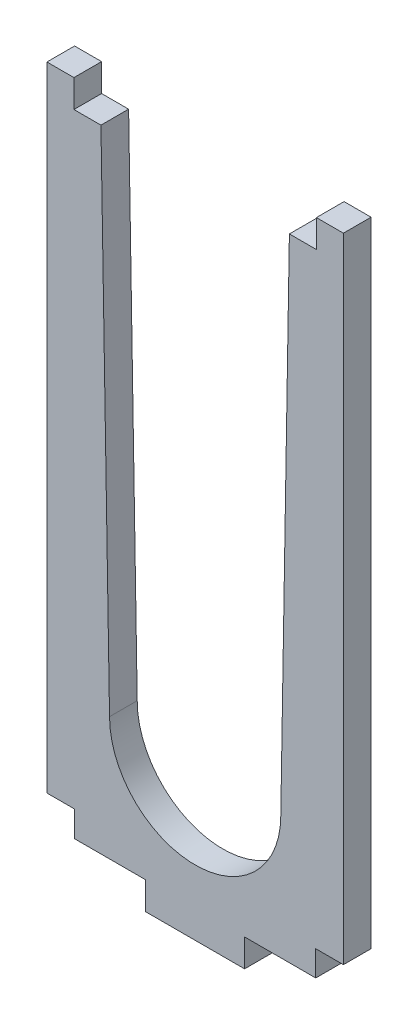
ISO-10303-21;
HEADER;
FILE_DESCRIPTION(('STEP AP214'),'2;1');
FILE_NAME('part.step','',(''),(''),'','','');
FILE_SCHEMA(('AUTOMOTIVE_DESIGN { 1 0 10303 214 1 1 1 1 }'));
ENDSEC;
DATA;
#1=APPLICATION_CONTEXT('core data for automotive mechanical design processes');
#2=APPLICATION_PROTOCOL_DEFINITION('international standard','automotive_design',2000,#1);
#3=PRODUCT_CONTEXT('',#1,'mechanical');
#4=PRODUCT('Part','Part','',(#3));
#5=PRODUCT_RELATED_PRODUCT_CATEGORY('part','',(#4));
#6=PRODUCT_DEFINITION_FORMATION('','',#4);
#7=PRODUCT_DEFINITION_CONTEXT('part definition',#1,'design');
#8=PRODUCT_DEFINITION('design','',#6,#7);
#9=PRODUCT_DEFINITION_SHAPE('','',#8);
#10=(LENGTH_UNIT() NAMED_UNIT(*) SI_UNIT(.MILLI.,.METRE.));
#11=(NAMED_UNIT(*) PLANE_ANGLE_UNIT() SI_UNIT($,.RADIAN.));
#12=(NAMED_UNIT(*) SI_UNIT($,.STERADIAN.) SOLID_ANGLE_UNIT());
#13=UNCERTAINTY_MEASURE_WITH_UNIT(LENGTH_MEASURE(1.E-05),#10,'distance_accuracy_value','');
#14=(GEOMETRIC_REPRESENTATION_CONTEXT(3) GLOBAL_UNCERTAINTY_ASSIGNED_CONTEXT((#13)) GLOBAL_UNIT_ASSIGNED_CONTEXT((#10,
#11,#12)) REPRESENTATION_CONTEXT('',''));
#15=CARTESIAN_POINT('',(0.,0.,0.));
#16=DIRECTION('',(0.,0.,1.));
#17=DIRECTION('',(1.,0.,0.));
#18=AXIS2_PLACEMENT_3D('',#15,#16,#17);
#19=CARTESIAN_POINT('',(57.15,0.,5.334));
#20=DIRECTION('',(-1.,0.,0.));
#21=DIRECTION('',(0.,-1.,0.));
#22=AXIS2_PLACEMENT_3D('',#19,#20,#21);
#23=PLANE('',#22);
#24=DIRECTION('',(0.,1.,0.));
#25=VECTOR('',#24,1.);
#26=CARTESIAN_POINT('',(57.15,0.,5.334));
#27=LINE('',#26,#25);
#28=CARTESIAN_POINT('',(57.15,10.2235,5.334));
#29=VERTEX_POINT('',#28);
#30=CARTESIAN_POINT('',(57.15,132.334,5.334));
#31=VERTEX_POINT('',#30);
#32=EDGE_CURVE('E11',#29,#31,#27,.T.);
#33=ORIENTED_EDGE('',*,*,#32,.F.);
#34=DIRECTION('',(0.,0.,1.));
#35=VECTOR('',#34,1.);
#36=CARTESIAN_POINT('',(57.15,10.2235,0.));
#37=LINE('',#36,#35);
#38=CARTESIAN_POINT('',(57.15,10.2235,0.));
#39=VERTEX_POINT('',#38);
#40=EDGE_CURVE('E226',#39,#29,#37,.T.);
#41=ORIENTED_EDGE('',*,*,#40,.F.);
#42=DIRECTION('',(0.,1.,0.));
#43=VECTOR('',#42,1.);
#44=CARTESIAN_POINT('',(57.15,0.,0.));
#45=LINE('',#44,#43);
#46=CARTESIAN_POINT('',(57.15,132.334,0.));
#47=VERTEX_POINT('',#46);
#48=EDGE_CURVE('E41',#39,#47,#45,.T.);
#49=ORIENTED_EDGE('',*,*,#48,.T.);
#50=DIRECTION('',(0.,0.,-1.));
#51=VECTOR('',#50,1.);
#52=CARTESIAN_POINT('',(57.15,132.334,0.));
#53=LINE('',#52,#51);
#54=EDGE_CURVE('E286',#31,#47,#53,.T.);
#55=ORIENTED_EDGE('',*,*,#54,.F.);
#56=EDGE_LOOP('',(#33,#41,#49,#55));
#57=FACE_BOUND('',#56,.T.);
#58=ADVANCED_FACE('F37',(#57),#23,.F.);
#59=CARTESIAN_POINT('',(0.,0.,5.334));
#60=DIRECTION('',(1.,0.,0.));
#61=DIRECTION('',(0.,1.,0.));
#62=AXIS2_PLACEMENT_3D('',#59,#60,#61);
#63=PLANE('',#62);
#64=DIRECTION('',(0.,-1.,0.));
#65=VECTOR('',#64,1.);
#66=CARTESIAN_POINT('',(0.,0.,0.));
#67=LINE('',#66,#65);
#68=CARTESIAN_POINT('',(0.,132.334,0.));
#69=VERTEX_POINT('',#68);
#70=CARTESIAN_POINT('',(0.,10.2997,0.));
#71=VERTEX_POINT('',#70);
#72=EDGE_CURVE('E343',#69,#71,#67,.T.);
#73=ORIENTED_EDGE('',*,*,#72,.T.);
#74=DIRECTION('',(0.,0.,1.));
#75=VECTOR('',#74,1.);
#76=CARTESIAN_POINT('',(0.,10.2997,0.));
#77=LINE('',#76,#75);
#78=CARTESIAN_POINT('',(0.,10.2997,5.334));
#79=VERTEX_POINT('',#78);
#80=EDGE_CURVE('E218',#71,#79,#77,.T.);
#81=ORIENTED_EDGE('',*,*,#80,.T.);
#82=DIRECTION('',(0.,-1.,0.));
#83=VECTOR('',#82,1.);
#84=CARTESIAN_POINT('',(0.,0.,5.334));
#85=LINE('',#84,#83);
#86=CARTESIAN_POINT('',(0.,132.334,5.334));
#87=VERTEX_POINT('',#86);
#88=EDGE_CURVE('E349',#87,#79,#85,.T.);
#89=ORIENTED_EDGE('',*,*,#88,.F.);
#90=DIRECTION('',(0.,0.,1.));
#91=VECTOR('',#90,1.);
#92=CARTESIAN_POINT('',(0.,132.334,0.));
#93=LINE('',#92,#91);
#94=EDGE_CURVE('E262',#69,#87,#93,.T.);
#95=ORIENTED_EDGE('',*,*,#94,.F.);
#96=EDGE_LOOP('',(#73,#81,#89,#95));
#97=FACE_BOUND('',#96,.T.);
#98=ADVANCED_FACE('F39',(#97),#63,.F.);
#99=CARTESIAN_POINT('',(0.,0.,5.334));
#100=DIRECTION('',(0.,1.,0.));
#101=DIRECTION('',(0.,0.,1.));
#102=AXIS2_PLACEMENT_3D('',#99,#100,#101);
#103=PLANE('',#102);
#104=DIRECTION('',(1.,0.,0.));
#105=VECTOR('',#104,1.);
#106=CARTESIAN_POINT('',(0.,0.,0.));
#107=LINE('',#106,#105);
#108=CARTESIAN_POINT('',(19.05,0.,0.));
#109=VERTEX_POINT('',#108);
#110=CARTESIAN_POINT('',(38.1,0.,0.));
#111=VERTEX_POINT('',#110);
#112=EDGE_CURVE('E355',#109,#111,#107,.T.);
#113=ORIENTED_EDGE('',*,*,#112,.T.);
#114=DIRECTION('',(0.,0.,-1.));
#115=VECTOR('',#114,1.);
#116=CARTESIAN_POINT('',(38.1,0.,0.));
#117=LINE('',#116,#115);
#118=CARTESIAN_POINT('',(38.1,0.,5.334));
#119=VERTEX_POINT('',#118);
#120=EDGE_CURVE('E296',#119,#111,#117,.T.);
#121=ORIENTED_EDGE('',*,*,#120,.F.);
#122=DIRECTION('',(1.,0.,0.));
#123=VECTOR('',#122,1.);
#124=CARTESIAN_POINT('',(0.,0.,5.334));
#125=LINE('',#124,#123);
#126=CARTESIAN_POINT('',(19.05,0.,5.334));
#127=VERTEX_POINT('',#126);
#128=EDGE_CURVE('E46',#127,#119,#125,.T.);
#129=ORIENTED_EDGE('',*,*,#128,.F.);
#130=DIRECTION('',(0.,0.,1.));
#131=VECTOR('',#130,1.);
#132=CARTESIAN_POINT('',(19.05,0.,0.));
#133=LINE('',#132,#131);
#134=EDGE_CURVE('E292',#109,#127,#133,.T.);
#135=ORIENTED_EDGE('',*,*,#134,.F.);
#136=EDGE_LOOP('',(#113,#121,#129,#135));
#137=FACE_BOUND('',#136,.T.);
#138=ADVANCED_FACE('F401',(#137),#103,.F.);
#139=CARTESIAN_POINT('',(0.,0.,5.334));
#140=DIRECTION('',(0.,0.,-1.));
#141=DIRECTION('',(-1.,0.,0.));
#142=AXIS2_PLACEMENT_3D('',#139,#140,#141);
#143=PLANE('',#142);
#144=ORIENTED_EDGE('',*,*,#88,.T.);
#145=DIRECTION('',(-1.,0.,0.));
#146=VECTOR('',#145,1.);
#147=CARTESIAN_POINT('',(0.,10.2997,5.334));
#148=LINE('',#147,#146);
#149=CARTESIAN_POINT('',(5.33576550806197,10.2997,5.334));
#150=VERTEX_POINT('',#149);
#151=EDGE_CURVE('E209',#150,#79,#148,.T.);
#152=ORIENTED_EDGE('',*,*,#151,.F.);
#153=DIRECTION('',(0.,1.,0.));
#154=VECTOR('',#153,1.);
#155=CARTESIAN_POINT('',(5.33576550806197,9.84249999999998,5.334));
#156=LINE('',#155,#154);
#157=CARTESIAN_POINT('',(5.33576550806197,9.84249999999998,5.334));
#158=VERTEX_POINT('',#157);
#159=EDGE_CURVE('E211',#158,#150,#156,.T.);
#160=ORIENTED_EDGE('',*,*,#159,.F.);
#161=DIRECTION('',(1.,0.,0.));
#162=VECTOR('',#161,1.);
#163=CARTESIAN_POINT('',(0.,9.84249999999998,5.334));
#164=LINE('',#163,#162);
#165=CARTESIAN_POINT('',(5.334,9.84249999999998,5.334));
#166=VERTEX_POINT('',#165);
#167=EDGE_CURVE('E193',#166,#158,#164,.T.);
#168=ORIENTED_EDGE('',*,*,#167,.F.);
#169=DIRECTION('',(0.,1.,0.));
#170=VECTOR('',#169,1.);
#171=CARTESIAN_POINT('',(5.334,5.334,5.334));
#172=LINE('',#171,#170);
#173=CARTESIAN_POINT('',(5.334,5.334,5.334));
#174=VERTEX_POINT('',#173);
#175=EDGE_CURVE('E241',#174,#166,#172,.T.);
#176=ORIENTED_EDGE('',*,*,#175,.F.);
#177=DIRECTION('',(-1.,0.,0.));
#178=VECTOR('',#177,1.);
#179=CARTESIAN_POINT('',(0.,5.334,5.334));
#180=LINE('',#179,#178);
#181=CARTESIAN_POINT('',(19.05,5.334,5.334));
#182=VERTEX_POINT('',#181);
#183=EDGE_CURVE('E314',#182,#174,#180,.T.);
#184=ORIENTED_EDGE('',*,*,#183,.F.);
#185=DIRECTION('',(0.,-1.,0.));
#186=VECTOR('',#185,1.);
#187=CARTESIAN_POINT('',(19.05,5.334,5.334));
#188=LINE('',#187,#186);
#189=EDGE_CURVE('E303',#182,#127,#188,.T.);
#190=ORIENTED_EDGE('',*,*,#189,.T.);
#191=ORIENTED_EDGE('',*,*,#128,.T.);
#192=DIRECTION('',(0.,-1.,0.));
#193=VECTOR('',#192,1.);
#194=CARTESIAN_POINT('',(38.1,5.334,5.334));
#195=LINE('',#194,#193);
#196=CARTESIAN_POINT('',(38.1,5.334,5.334));
#197=VERTEX_POINT('',#196);
#198=EDGE_CURVE('E301',#197,#119,#195,.T.);
#199=ORIENTED_EDGE('',*,*,#198,.F.);
#200=DIRECTION('',(-1.,0.,0.));
#201=VECTOR('',#200,1.);
#202=CARTESIAN_POINT('',(57.15,5.334,5.334));
#203=LINE('',#202,#201);
#204=CARTESIAN_POINT('',(51.816,5.334,5.334));
#205=VERTEX_POINT('',#204);
#206=EDGE_CURVE('E293',#205,#197,#203,.T.);
#207=ORIENTED_EDGE('',*,*,#206,.F.);
#208=DIRECTION('',(0.,1.,0.));
#209=VECTOR('',#208,1.);
#210=CARTESIAN_POINT('',(51.816,9.84250000000004,5.334));
#211=LINE('',#210,#209);
#212=CARTESIAN_POINT('',(51.816,10.2235,5.334));
#213=VERTEX_POINT('',#212);
#214=EDGE_CURVE('E221',#205,#213,#211,.T.);
#215=ORIENTED_EDGE('',*,*,#214,.T.);
#216=DIRECTION('',(-1.,0.,0.));
#217=VECTOR('',#216,1.);
#218=CARTESIAN_POINT('',(51.816,10.2235,5.334));
#219=LINE('',#218,#217);
#220=EDGE_CURVE('E227',#29,#213,#219,.T.);
#221=ORIENTED_EDGE('',*,*,#220,.F.);
#222=ORIENTED_EDGE('',*,*,#32,.T.);
#223=DIRECTION('',(1.,0.,0.));
#224=VECTOR('',#223,1.);
#225=CARTESIAN_POINT('',(46.736,132.334,5.334));
#226=LINE('',#225,#224);
#227=CARTESIAN_POINT('',(51.943,132.334,5.334));
#228=VERTEX_POINT('',#227);
#229=EDGE_CURVE('E283',#228,#31,#226,.T.);
#230=ORIENTED_EDGE('',*,*,#229,.F.);
#231=DIRECTION('',(0.,1.,0.));
#232=VECTOR('',#231,1.);
#233=CARTESIAN_POINT('',(51.943,127.,5.334));
#234=LINE('',#233,#232);
#235=CARTESIAN_POINT('',(51.943,127.,5.334));
#236=VERTEX_POINT('',#235);
#237=EDGE_CURVE('E62',#236,#228,#234,.T.);
#238=ORIENTED_EDGE('',*,*,#237,.F.);
#239=DIRECTION('',(1.,0.,0.));
#240=VECTOR('',#239,1.);
#241=CARTESIAN_POINT('',(46.736,127.,5.334));
#242=LINE('',#241,#240);
#243=CARTESIAN_POINT('',(46.736,127.,5.334));
#244=VERTEX_POINT('',#243);
#245=EDGE_CURVE('E264',#244,#236,#242,.T.);
#246=ORIENTED_EDGE('',*,*,#245,.F.);
#247=DIRECTION('',(-0.0169080241525073,-0.999857049142155,0.));
#248=VECTOR('',#247,1.);
#249=CARTESIAN_POINT('',(44.5756269461976,-0.753793532451566,5.334));
#250=LINE('',#249,#248);
#251=CARTESIAN_POINT('',(45.0801802982121,29.083,5.334));
#252=VERTEX_POINT('',#251);
#253=EDGE_CURVE('E326',#244,#252,#250,.T.);
#254=ORIENTED_EDGE('',*,*,#253,.T.);
#255=CARTESIAN_POINT('',(28.575,29.083,5.334));
#256=DIRECTION('',(0.,0.,1.));
#257=DIRECTION('',(1.,0.,0.));
#258=AXIS2_PLACEMENT_3D('',#255,#256,#257);
#259=CIRCLE('',#258,16.5051802982121);
#260=CARTESIAN_POINT('',(12.0698197017879,29.083,5.334));
#261=VERTEX_POINT('',#260);
#262=EDGE_CURVE('E335',#261,#252,#259,.T.);
#263=ORIENTED_EDGE('',*,*,#262,.F.);
#264=DIRECTION('',(0.0169080241525077,-0.999857049142155,0.));
#265=VECTOR('',#264,1.);
#266=CARTESIAN_POINT('',(12.5580349386081,0.212361915367997,5.334));
#267=LINE('',#266,#265);
#268=CARTESIAN_POINT('',(10.414,127.,5.334));
#269=VERTEX_POINT('',#268);
#270=EDGE_CURVE('E307',#269,#261,#267,.T.);
#271=ORIENTED_EDGE('',*,*,#270,.F.);
#272=DIRECTION('',(1.,0.,0.));
#273=VECTOR('',#272,1.);
#274=CARTESIAN_POINT('',(10.414,127.,5.334));
#275=LINE('',#274,#273);
#276=CARTESIAN_POINT('',(5.20699999999999,127.,5.334));
#277=VERTEX_POINT('',#276);
#278=EDGE_CURVE('E254',#277,#269,#275,.T.);
#279=ORIENTED_EDGE('',*,*,#278,.F.);
#280=DIRECTION('',(0.,1.,0.));
#281=VECTOR('',#280,1.);
#282=CARTESIAN_POINT('',(5.20699999999999,127.,5.334));
#283=LINE('',#282,#281);
#284=CARTESIAN_POINT('',(5.20699999999999,132.334,5.334));
#285=VERTEX_POINT('',#284);
#286=EDGE_CURVE('E259',#277,#285,#283,.T.);
#287=ORIENTED_EDGE('',*,*,#286,.T.);
#288=DIRECTION('',(1.,0.,0.));
#289=VECTOR('',#288,1.);
#290=CARTESIAN_POINT('',(0.,132.334,5.334));
#291=LINE('',#290,#289);
#292=EDGE_CURVE('E278',#87,#285,#291,.T.);
#293=ORIENTED_EDGE('',*,*,#292,.F.);
#294=EDGE_LOOP('',(#144,#152,#160,#168,#176,#184,#190,#191,#199,#207,#215,#221,#222,#230,#238,
#246,#254,#263,#271,#279,#287,#293));
#295=FACE_BOUND('',#294,.T.);
#296=ADVANCED_FACE('F379',(#295),#143,.F.);
#297=CARTESIAN_POINT('',(0.,0.,0.));
#298=DIRECTION('',(0.,0.,-1.));
#299=DIRECTION('',(-1.,0.,0.));
#300=AXIS2_PLACEMENT_3D('',#297,#298,#299);
#301=PLANE('',#300);
#302=DIRECTION('',(-1.,0.,0.));
#303=VECTOR('',#302,1.);
#304=CARTESIAN_POINT('',(0.,10.2997,0.));
#305=LINE('',#304,#303);
#306=CARTESIAN_POINT('',(5.33576550806197,10.2997,0.));
#307=VERTEX_POINT('',#306);
#308=EDGE_CURVE('E198',#307,#71,#305,.T.);
#309=ORIENTED_EDGE('',*,*,#308,.T.);
#310=ORIENTED_EDGE('',*,*,#72,.F.);
#311=DIRECTION('',(-1.,0.,0.));
#312=VECTOR('',#311,1.);
#313=CARTESIAN_POINT('',(0.,132.334,0.));
#314=LINE('',#313,#312);
#315=CARTESIAN_POINT('',(5.20699999999999,132.334,0.));
#316=VERTEX_POINT('',#315);
#317=EDGE_CURVE('E281',#316,#69,#314,.T.);
#318=ORIENTED_EDGE('',*,*,#317,.F.);
#319=DIRECTION('',(0.,1.,0.));
#320=VECTOR('',#319,1.);
#321=CARTESIAN_POINT('',(5.20699999999999,127.,0.));
#322=LINE('',#321,#320);
#323=CARTESIAN_POINT('',(5.20699999999999,127.,0.));
#324=VERTEX_POINT('',#323);
#325=EDGE_CURVE('E256',#324,#316,#322,.T.);
#326=ORIENTED_EDGE('',*,*,#325,.F.);
#327=DIRECTION('',(-1.,0.,0.));
#328=VECTOR('',#327,1.);
#329=CARTESIAN_POINT('',(10.414,127.,0.));
#330=LINE('',#329,#328);
#331=CARTESIAN_POINT('',(10.414,127.,0.));
#332=VERTEX_POINT('',#331);
#333=EDGE_CURVE('E247',#332,#324,#330,.T.);
#334=ORIENTED_EDGE('',*,*,#333,.F.);
#335=DIRECTION('',(0.0169080241525077,-0.999857049142155,0.));
#336=VECTOR('',#335,1.);
#337=CARTESIAN_POINT('',(12.5580349386081,0.212361915367997,0.));
#338=LINE('',#337,#336);
#339=CARTESIAN_POINT('',(12.0698197017879,29.083,0.));
#340=VERTEX_POINT('',#339);
#341=EDGE_CURVE('E322',#332,#340,#338,.T.);
#342=ORIENTED_EDGE('',*,*,#341,.T.);
#343=CARTESIAN_POINT('',(28.575,29.083,0.));
#344=DIRECTION('',(0.,0.,1.));
#345=DIRECTION('',(1.,0.,0.));
#346=AXIS2_PLACEMENT_3D('',#343,#344,#345);
#347=CIRCLE('',#346,16.5051802982121);
#348=CARTESIAN_POINT('',(45.0801802982121,29.083,0.));
#349=VERTEX_POINT('',#348);
#350=EDGE_CURVE('E325',#340,#349,#347,.T.);
#351=ORIENTED_EDGE('',*,*,#350,.T.);
#352=DIRECTION('',(-0.0169080241525073,-0.999857049142155,0.));
#353=VECTOR('',#352,1.);
#354=CARTESIAN_POINT('',(44.5756269461976,-0.753793532451566,0.));
#355=LINE('',#354,#353);
#356=CARTESIAN_POINT('',(46.736,127.,0.));
#357=VERTEX_POINT('',#356);
#358=EDGE_CURVE('E329',#357,#349,#355,.T.);
#359=ORIENTED_EDGE('',*,*,#358,.F.);
#360=DIRECTION('',(-1.,0.,0.));
#361=VECTOR('',#360,1.);
#362=CARTESIAN_POINT('',(46.736,127.,0.));
#363=LINE('',#362,#361);
#364=CARTESIAN_POINT('',(51.943,127.,0.));
#365=VERTEX_POINT('',#364);
#366=EDGE_CURVE('E270',#365,#357,#363,.T.);
#367=ORIENTED_EDGE('',*,*,#366,.F.);
#368=DIRECTION('',(0.,1.,0.));
#369=VECTOR('',#368,1.);
#370=CARTESIAN_POINT('',(51.943,127.,0.));
#371=LINE('',#370,#369);
#372=CARTESIAN_POINT('',(51.943,132.334,0.));
#373=VERTEX_POINT('',#372);
#374=EDGE_CURVE('E258',#365,#373,#371,.T.);
#375=ORIENTED_EDGE('',*,*,#374,.T.);
#376=DIRECTION('',(-1.,0.,0.));
#377=VECTOR('',#376,1.);
#378=CARTESIAN_POINT('',(46.736,132.334,0.));
#379=LINE('',#378,#377);
#380=EDGE_CURVE('E289',#47,#373,#379,.T.);
#381=ORIENTED_EDGE('',*,*,#380,.F.);
#382=ORIENTED_EDGE('',*,*,#48,.F.);
#383=DIRECTION('',(-1.,0.,0.));
#384=VECTOR('',#383,1.);
#385=CARTESIAN_POINT('',(51.816,10.2235,0.));
#386=LINE('',#385,#384);
#387=CARTESIAN_POINT('',(51.816,10.2235,0.));
#388=VERTEX_POINT('',#387);
#389=EDGE_CURVE('E223',#39,#388,#386,.T.);
#390=ORIENTED_EDGE('',*,*,#389,.T.);
#391=DIRECTION('',(0.,1.,0.));
#392=VECTOR('',#391,1.);
#393=CARTESIAN_POINT('',(51.816,5.334,0.));
#394=LINE('',#393,#392);
#395=CARTESIAN_POINT('',(51.816,5.334,0.));
#396=VERTEX_POINT('',#395);
#397=EDGE_CURVE('E234',#396,#388,#394,.T.);
#398=ORIENTED_EDGE('',*,*,#397,.F.);
#399=DIRECTION('',(1.,0.,0.));
#400=VECTOR('',#399,1.);
#401=CARTESIAN_POINT('',(57.15,5.334,0.));
#402=LINE('',#401,#400);
#403=CARTESIAN_POINT('',(38.1,5.334,0.));
#404=VERTEX_POINT('',#403);
#405=EDGE_CURVE('E298',#404,#396,#402,.T.);
#406=ORIENTED_EDGE('',*,*,#405,.F.);
#407=DIRECTION('',(0.,-1.,0.));
#408=VECTOR('',#407,1.);
#409=CARTESIAN_POINT('',(38.1,5.334,0.));
#410=LINE('',#409,#408);
#411=EDGE_CURVE('E304',#404,#111,#410,.T.);
#412=ORIENTED_EDGE('',*,*,#411,.T.);
#413=ORIENTED_EDGE('',*,*,#112,.F.);
#414=DIRECTION('',(0.,-1.,0.));
#415=VECTOR('',#414,1.);
#416=CARTESIAN_POINT('',(19.05,5.334,0.));
#417=LINE('',#416,#415);
#418=CARTESIAN_POINT('',(19.05,5.334,0.));
#419=VERTEX_POINT('',#418);
#420=EDGE_CURVE('E317',#419,#109,#417,.T.);
#421=ORIENTED_EDGE('',*,*,#420,.F.);
#422=DIRECTION('',(1.,0.,0.));
#423=VECTOR('',#422,1.);
#424=CARTESIAN_POINT('',(0.,5.334,0.));
#425=LINE('',#424,#423);
#426=CARTESIAN_POINT('',(5.334,5.334,0.));
#427=VERTEX_POINT('',#426);
#428=EDGE_CURVE('E309',#427,#419,#425,.T.);
#429=ORIENTED_EDGE('',*,*,#428,.F.);
#430=DIRECTION('',(0.,-1.,0.));
#431=VECTOR('',#430,1.);
#432=CARTESIAN_POINT('',(5.334,5.334,0.));
#433=LINE('',#432,#431);
#434=CARTESIAN_POINT('',(5.334,9.84249999999998,0.));
#435=VERTEX_POINT('',#434);
#436=EDGE_CURVE('E54',#435,#427,#433,.T.);
#437=ORIENTED_EDGE('',*,*,#436,.F.);
#438=DIRECTION('',(1.,0.,0.));
#439=VECTOR('',#438,1.);
#440=CARTESIAN_POINT('',(0.,9.84249999999998,0.));
#441=LINE('',#440,#439);
#442=CARTESIAN_POINT('',(5.33576550806197,9.84249999999998,0.));
#443=VERTEX_POINT('',#442);
#444=EDGE_CURVE('E191',#435,#443,#441,.T.);
#445=ORIENTED_EDGE('',*,*,#444,.T.);
#446=DIRECTION('',(0.,1.,0.));
#447=VECTOR('',#446,1.);
#448=CARTESIAN_POINT('',(5.33576550806197,9.84249999999998,0.));
#449=LINE('',#448,#447);
#450=EDGE_CURVE('E201',#443,#307,#449,.T.);
#451=ORIENTED_EDGE('',*,*,#450,.T.);
#452=EDGE_LOOP('',(#309,#310,#318,#326,#334,#342,#351,#359,#367,#375,#381,#382,#390,#398,#406,
#412,#413,#421,#429,#437,#445,#451));
#453=FACE_BOUND('',#452,.T.);
#454=ADVANCED_FACE('F207',(#453),#301,.T.);
#455=CARTESIAN_POINT('',(12.5580349386081,0.212361915367997,0.));
#456=DIRECTION('',(-0.999857049142155,-0.0169080241525077,0.));
#457=DIRECTION('',(0.0169080241525077,-0.999857049142155,0.));
#458=AXIS2_PLACEMENT_3D('',#455,#456,#457);
#459=PLANE('',#458);
#460=ORIENTED_EDGE('',*,*,#270,.T.);
#461=DIRECTION('',(0.,0.,1.));
#462=VECTOR('',#461,1.);
#463=CARTESIAN_POINT('',(12.0698197017879,29.083,0.));
#464=LINE('',#463,#462);
#465=EDGE_CURVE('E332',#340,#261,#464,.T.);
#466=ORIENTED_EDGE('',*,*,#465,.F.);
#467=ORIENTED_EDGE('',*,*,#341,.F.);
#468=DIRECTION('',(0.,0.,1.));
#469=VECTOR('',#468,1.);
#470=CARTESIAN_POINT('',(10.414,127.,0.));
#471=LINE('',#470,#469);
#472=EDGE_CURVE('E340',#332,#269,#471,.T.);
#473=ORIENTED_EDGE('',*,*,#472,.T.);
#474=EDGE_LOOP('',(#460,#466,#467,#473));
#475=FACE_BOUND('',#474,.T.);
#476=ADVANCED_FACE('F429',(#475),#459,.F.);
#477=CARTESIAN_POINT('',(44.5756269461976,-0.753793532451566,0.));
#478=DIRECTION('',(-0.999857049142155,0.0169080241525073,0.));
#479=DIRECTION('',(-0.0169080241525073,-0.999857049142155,0.));
#480=AXIS2_PLACEMENT_3D('',#477,#478,#479);
#481=PLANE('',#480);
#482=ORIENTED_EDGE('',*,*,#253,.F.);
#483=DIRECTION('',(0.,0.,1.));
#484=VECTOR('',#483,1.);
#485=CARTESIAN_POINT('',(46.736,127.,0.));
#486=LINE('',#485,#484);
#487=EDGE_CURVE('E344',#357,#244,#486,.T.);
#488=ORIENTED_EDGE('',*,*,#487,.F.);
#489=ORIENTED_EDGE('',*,*,#358,.T.);
#490=DIRECTION('',(0.,0.,1.));
#491=VECTOR('',#490,1.);
#492=CARTESIAN_POINT('',(45.0801802982121,29.083,0.));
#493=LINE('',#492,#491);
#494=EDGE_CURVE('E346',#349,#252,#493,.T.);
#495=ORIENTED_EDGE('',*,*,#494,.T.);
#496=EDGE_LOOP('',(#482,#488,#489,#495));
#497=FACE_BOUND('',#496,.T.);
#498=ADVANCED_FACE('F434',(#497),#481,.T.);
#499=CARTESIAN_POINT('',(28.575,29.083,0.));
#500=DIRECTION('',(0.,0.,1.));
#501=DIRECTION('',(1.,0.,0.));
#502=AXIS2_PLACEMENT_3D('',#499,#500,#501);
#503=CYLINDRICAL_SURFACE('',#502,16.5051802982121);
#504=ORIENTED_EDGE('',*,*,#262,.T.);
#505=ORIENTED_EDGE('',*,*,#494,.F.);
#506=ORIENTED_EDGE('',*,*,#350,.F.);
#507=ORIENTED_EDGE('',*,*,#465,.T.);
#508=EDGE_LOOP('',(#504,#505,#506,#507));
#509=FACE_BOUND('',#508,.T.);
#510=ADVANCED_FACE('F432',(#509),#503,.F.);
#511=CARTESIAN_POINT('',(19.05,5.334,0.));
#512=DIRECTION('',(1.,0.,0.));
#513=DIRECTION('',(0.,0.,-1.));
#514=AXIS2_PLACEMENT_3D('',#511,#512,#513);
#515=PLANE('',#514);
#516=ORIENTED_EDGE('',*,*,#134,.T.);
#517=ORIENTED_EDGE('',*,*,#189,.F.);
#518=DIRECTION('',(0.,0.,1.));
#519=VECTOR('',#518,1.);
#520=CARTESIAN_POINT('',(19.05,5.334,0.));
#521=LINE('',#520,#519);
#522=EDGE_CURVE('E311',#419,#182,#521,.T.);
#523=ORIENTED_EDGE('',*,*,#522,.F.);
#524=ORIENTED_EDGE('',*,*,#420,.T.);
#525=EDGE_LOOP('',(#516,#517,#523,#524));
#526=FACE_BOUND('',#525,.T.);
#527=ADVANCED_FACE('F399',(#526),#515,.F.);
#528=CARTESIAN_POINT('',(0.,5.334,0.));
#529=DIRECTION('',(0.,1.,0.));
#530=DIRECTION('',(0.,0.,1.));
#531=AXIS2_PLACEMENT_3D('',#528,#529,#530);
#532=PLANE('',#531);
#533=ORIENTED_EDGE('',*,*,#183,.T.);
#534=DIRECTION('',(0.,0.,1.));
#535=VECTOR('',#534,1.);
#536=CARTESIAN_POINT('',(5.334,5.334,0.));
#537=LINE('',#536,#535);
#538=EDGE_CURVE('E239',#427,#174,#537,.T.);
#539=ORIENTED_EDGE('',*,*,#538,.F.);
#540=ORIENTED_EDGE('',*,*,#428,.T.);
#541=ORIENTED_EDGE('',*,*,#522,.T.);
#542=EDGE_LOOP('',(#533,#539,#540,#541));
#543=FACE_BOUND('',#542,.T.);
#544=ADVANCED_FACE('F405',(#543),#532,.F.);
#545=CARTESIAN_POINT('',(38.1,5.334,0.));
#546=DIRECTION('',(-1.,0.,0.));
#547=DIRECTION('',(0.,0.,1.));
#548=AXIS2_PLACEMENT_3D('',#545,#546,#547);
#549=PLANE('',#548);
#550=ORIENTED_EDGE('',*,*,#120,.T.);
#551=ORIENTED_EDGE('',*,*,#411,.F.);
#552=DIRECTION('',(0.,0.,-1.));
#553=VECTOR('',#552,1.);
#554=CARTESIAN_POINT('',(38.1,5.334,0.));
#555=LINE('',#554,#553);
#556=EDGE_CURVE('E295',#197,#404,#555,.T.);
#557=ORIENTED_EDGE('',*,*,#556,.F.);
#558=ORIENTED_EDGE('',*,*,#198,.T.);
#559=EDGE_LOOP('',(#550,#551,#557,#558));
#560=FACE_BOUND('',#559,.T.);
#561=ADVANCED_FACE('F395',(#560),#549,.F.);
#562=CARTESIAN_POINT('',(0.,5.334,0.));
#563=DIRECTION('',(0.,-1.,0.));
#564=DIRECTION('',(0.,0.,-1.));
#565=AXIS2_PLACEMENT_3D('',#562,#563,#564);
#566=PLANE('',#565);
#567=DIRECTION('',(0.,0.,-1.));
#568=VECTOR('',#567,1.);
#569=CARTESIAN_POINT('',(51.816,5.334,0.));
#570=LINE('',#569,#568);
#571=EDGE_CURVE('E236',#205,#396,#570,.T.);
#572=ORIENTED_EDGE('',*,*,#571,.F.);
#573=ORIENTED_EDGE('',*,*,#206,.T.);
#574=ORIENTED_EDGE('',*,*,#556,.T.);
#575=ORIENTED_EDGE('',*,*,#405,.T.);
#576=EDGE_LOOP('',(#572,#573,#574,#575));
#577=FACE_BOUND('',#576,.T.);
#578=ADVANCED_FACE('F390',(#577),#566,.T.);
#579=CARTESIAN_POINT('',(0.,132.334,0.));
#580=DIRECTION('',(0.,1.,0.));
#581=DIRECTION('',(0.,0.,1.));
#582=AXIS2_PLACEMENT_3D('',#579,#580,#581);
#583=PLANE('',#582);
#584=DIRECTION('',(0.,0.,-1.));
#585=VECTOR('',#584,1.);
#586=CARTESIAN_POINT('',(51.943,132.334,0.));
#587=LINE('',#586,#585);
#588=EDGE_CURVE('E246',#228,#373,#587,.T.);
#589=ORIENTED_EDGE('',*,*,#588,.F.);
#590=ORIENTED_EDGE('',*,*,#229,.T.);
#591=ORIENTED_EDGE('',*,*,#54,.T.);
#592=ORIENTED_EDGE('',*,*,#380,.T.);
#593=EDGE_LOOP('',(#589,#590,#591,#592));
#594=FACE_BOUND('',#593,.T.);
#595=ADVANCED_FACE('F368',(#594),#583,.T.);
#596=CARTESIAN_POINT('',(0.,132.334,0.));
#597=DIRECTION('',(0.,1.,0.));
#598=DIRECTION('',(0.,0.,1.));
#599=AXIS2_PLACEMENT_3D('',#596,#597,#598);
#600=PLANE('',#599);
#601=DIRECTION('',(0.,0.,1.));
#602=VECTOR('',#601,1.);
#603=CARTESIAN_POINT('',(5.20699999999999,132.334,0.));
#604=LINE('',#603,#602);
#605=EDGE_CURVE('E251',#316,#285,#604,.T.);
#606=ORIENTED_EDGE('',*,*,#605,.F.);
#607=ORIENTED_EDGE('',*,*,#317,.T.);
#608=ORIENTED_EDGE('',*,*,#94,.T.);
#609=ORIENTED_EDGE('',*,*,#292,.T.);
#610=EDGE_LOOP('',(#606,#607,#608,#609));
#611=FACE_BOUND('',#610,.T.);
#612=ADVANCED_FACE('F419',(#611),#600,.T.);
#613=CARTESIAN_POINT('',(5.20699999999999,127.,0.));
#614=DIRECTION('',(-1.,0.,0.));
#615=DIRECTION('',(0.,0.,1.));
#616=AXIS2_PLACEMENT_3D('',#613,#614,#615);
#617=PLANE('',#616);
#618=ORIENTED_EDGE('',*,*,#605,.T.);
#619=ORIENTED_EDGE('',*,*,#286,.F.);
#620=DIRECTION('',(0.,0.,1.));
#621=VECTOR('',#620,1.);
#622=CARTESIAN_POINT('',(5.20699999999999,127.,0.));
#623=LINE('',#622,#621);
#624=EDGE_CURVE('E250',#324,#277,#623,.T.);
#625=ORIENTED_EDGE('',*,*,#624,.F.);
#626=ORIENTED_EDGE('',*,*,#325,.T.);
#627=EDGE_LOOP('',(#618,#619,#625,#626));
#628=FACE_BOUND('',#627,.T.);
#629=ADVANCED_FACE('F421',(#628),#617,.F.);
#630=CARTESIAN_POINT('',(0.,127.,0.));
#631=DIRECTION('',(0.,-1.,0.));
#632=DIRECTION('',(0.,0.,-1.));
#633=AXIS2_PLACEMENT_3D('',#630,#631,#632);
#634=PLANE('',#633);
#635=ORIENTED_EDGE('',*,*,#472,.F.);
#636=ORIENTED_EDGE('',*,*,#333,.T.);
#637=ORIENTED_EDGE('',*,*,#624,.T.);
#638=ORIENTED_EDGE('',*,*,#278,.T.);
#639=EDGE_LOOP('',(#635,#636,#637,#638));
#640=FACE_BOUND('',#639,.T.);
#641=ADVANCED_FACE('F426',(#640),#634,.F.);
#642=CARTESIAN_POINT('',(51.943,127.,0.));
#643=DIRECTION('',(1.,0.,0.));
#644=DIRECTION('',(0.,0.,-1.));
#645=AXIS2_PLACEMENT_3D('',#642,#643,#644);
#646=PLANE('',#645);
#647=ORIENTED_EDGE('',*,*,#588,.T.);
#648=ORIENTED_EDGE('',*,*,#374,.F.);
#649=DIRECTION('',(0.,0.,-1.));
#650=VECTOR('',#649,1.);
#651=CARTESIAN_POINT('',(51.943,127.,0.));
#652=LINE('',#651,#650);
#653=EDGE_CURVE('E267',#236,#365,#652,.T.);
#654=ORIENTED_EDGE('',*,*,#653,.F.);
#655=ORIENTED_EDGE('',*,*,#237,.T.);
#656=EDGE_LOOP('',(#647,#648,#654,#655));
#657=FACE_BOUND('',#656,.T.);
#658=ADVANCED_FACE('F372',(#657),#646,.F.);
#659=CARTESIAN_POINT('',(0.,127.,0.));
#660=DIRECTION('',(0.,1.,0.));
#661=DIRECTION('',(0.,0.,1.));
#662=AXIS2_PLACEMENT_3D('',#659,#660,#661);
#663=PLANE('',#662);
#664=ORIENTED_EDGE('',*,*,#487,.T.);
#665=ORIENTED_EDGE('',*,*,#245,.T.);
#666=ORIENTED_EDGE('',*,*,#653,.T.);
#667=ORIENTED_EDGE('',*,*,#366,.T.);
#668=EDGE_LOOP('',(#664,#665,#666,#667));
#669=FACE_BOUND('',#668,.T.);
#670=ADVANCED_FACE('F374',(#669),#663,.T.);
#671=CARTESIAN_POINT('',(5.334,0.,0.));
#672=DIRECTION('',(1.,0.,0.));
#673=DIRECTION('',(0.,1.,0.));
#674=AXIS2_PLACEMENT_3D('',#671,#672,#673);
#675=PLANE('',#674);
#676=ORIENTED_EDGE('',*,*,#436,.T.);
#677=ORIENTED_EDGE('',*,*,#538,.T.);
#678=ORIENTED_EDGE('',*,*,#175,.T.);
#679=DIRECTION('',(0.,0.,-1.));
#680=VECTOR('',#679,1.);
#681=CARTESIAN_POINT('',(5.334,9.84249999999998,0.));
#682=LINE('',#681,#680);
#683=EDGE_CURVE('E244',#166,#435,#682,.T.);
#684=ORIENTED_EDGE('',*,*,#683,.T.);
#685=EDGE_LOOP('',(#676,#677,#678,#684));
#686=FACE_BOUND('',#685,.T.);
#687=ADVANCED_FACE('F406',(#686),#675,.F.);
#688=CARTESIAN_POINT('',(51.816,0.,0.));
#689=DIRECTION('',(1.,0.,0.));
#690=DIRECTION('',(0.,0.,-1.));
#691=AXIS2_PLACEMENT_3D('',#688,#689,#690);
#692=PLANE('',#691);
#693=ORIENTED_EDGE('',*,*,#397,.T.);
#694=DIRECTION('',(0.,0.,1.));
#695=VECTOR('',#694,1.);
#696=CARTESIAN_POINT('',(51.816,10.2235,0.));
#697=LINE('',#696,#695);
#698=EDGE_CURVE('E216',#388,#213,#697,.T.);
#699=ORIENTED_EDGE('',*,*,#698,.T.);
#700=ORIENTED_EDGE('',*,*,#214,.F.);
#701=ORIENTED_EDGE('',*,*,#571,.T.);
#702=EDGE_LOOP('',(#693,#699,#700,#701));
#703=FACE_BOUND('',#702,.T.);
#704=ADVANCED_FACE('F597',(#703),#692,.T.);
#705=CARTESIAN_POINT('',(51.816,10.2235,0.));
#706=DIRECTION('',(0.,1.,0.));
#707=DIRECTION('',(0.,0.,1.));
#708=AXIS2_PLACEMENT_3D('',#705,#706,#707);
#709=PLANE('',#708);
#710=ORIENTED_EDGE('',*,*,#220,.T.);
#711=ORIENTED_EDGE('',*,*,#698,.F.);
#712=ORIENTED_EDGE('',*,*,#389,.F.);
#713=ORIENTED_EDGE('',*,*,#40,.T.);
#714=EDGE_LOOP('',(#710,#711,#712,#713));
#715=FACE_BOUND('',#714,.T.);
#716=ADVANCED_FACE('F385',(#715),#709,.F.);
#717=CARTESIAN_POINT('',(0.,9.84249999999998,0.));
#718=DIRECTION('',(0.,-1.,0.));
#719=DIRECTION('',(0.,0.,-1.));
#720=AXIS2_PLACEMENT_3D('',#717,#718,#719);
#721=PLANE('',#720);
#722=ORIENTED_EDGE('',*,*,#167,.T.);
#723=DIRECTION('',(0.,0.,1.));
#724=VECTOR('',#723,1.);
#725=CARTESIAN_POINT('',(5.33576550806197,9.84249999999998,0.));
#726=LINE('',#725,#724);
#727=EDGE_CURVE('E187',#443,#158,#726,.T.);
#728=ORIENTED_EDGE('',*,*,#727,.F.);
#729=ORIENTED_EDGE('',*,*,#444,.F.);
#730=ORIENTED_EDGE('',*,*,#683,.F.);
#731=EDGE_LOOP('',(#722,#728,#729,#730));
#732=FACE_BOUND('',#731,.T.);
#733=ADVANCED_FACE('F189',(#732),#721,.F.);
#734=CARTESIAN_POINT('',(0.,10.2997,0.));
#735=DIRECTION('',(0.,1.,0.));
#736=DIRECTION('',(0.,0.,1.));
#737=AXIS2_PLACEMENT_3D('',#734,#735,#736);
#738=PLANE('',#737);
#739=ORIENTED_EDGE('',*,*,#151,.T.);
#740=ORIENTED_EDGE('',*,*,#80,.F.);
#741=ORIENTED_EDGE('',*,*,#308,.F.);
#742=DIRECTION('',(0.,0.,1.));
#743=VECTOR('',#742,1.);
#744=CARTESIAN_POINT('',(5.33576550806197,10.2997,0.));
#745=LINE('',#744,#743);
#746=EDGE_CURVE('E197',#307,#150,#745,.T.);
#747=ORIENTED_EDGE('',*,*,#746,.T.);
#748=EDGE_LOOP('',(#739,#740,#741,#747));
#749=FACE_BOUND('',#748,.T.);
#750=ADVANCED_FACE('F410',(#749),#738,.F.);
#751=CARTESIAN_POINT('',(5.33576550806197,9.84249999999998,0.));
#752=DIRECTION('',(1.,0.,0.));
#753=DIRECTION('',(0.,0.,-1.));
#754=AXIS2_PLACEMENT_3D('',#751,#752,#753);
#755=PLANE('',#754);
#756=ORIENTED_EDGE('',*,*,#159,.T.);
#757=ORIENTED_EDGE('',*,*,#746,.F.);
#758=ORIENTED_EDGE('',*,*,#450,.F.);
#759=ORIENTED_EDGE('',*,*,#727,.T.);
#760=EDGE_LOOP('',(#756,#757,#758,#759));
#761=FACE_BOUND('',#760,.T.);
#762=ADVANCED_FACE('F202',(#761),#755,.F.);
#763=CLOSED_SHELL('',(#58,#98,#138,#296,#454,#476,#498,#510,#527,#544,#561,#578,#595,#612,#629,
#641,#658,#670,#687,#704,#716,#733,#750,#762));
#764=MANIFOLD_SOLID_BREP('B2',#763);
#765=ADVANCED_BREP_SHAPE_REPRESENTATION('',(#18,#764),#14);
#766=SHAPE_DEFINITION_REPRESENTATION(#9,#765);
ENDSEC;
END-ISO-10303-21;
